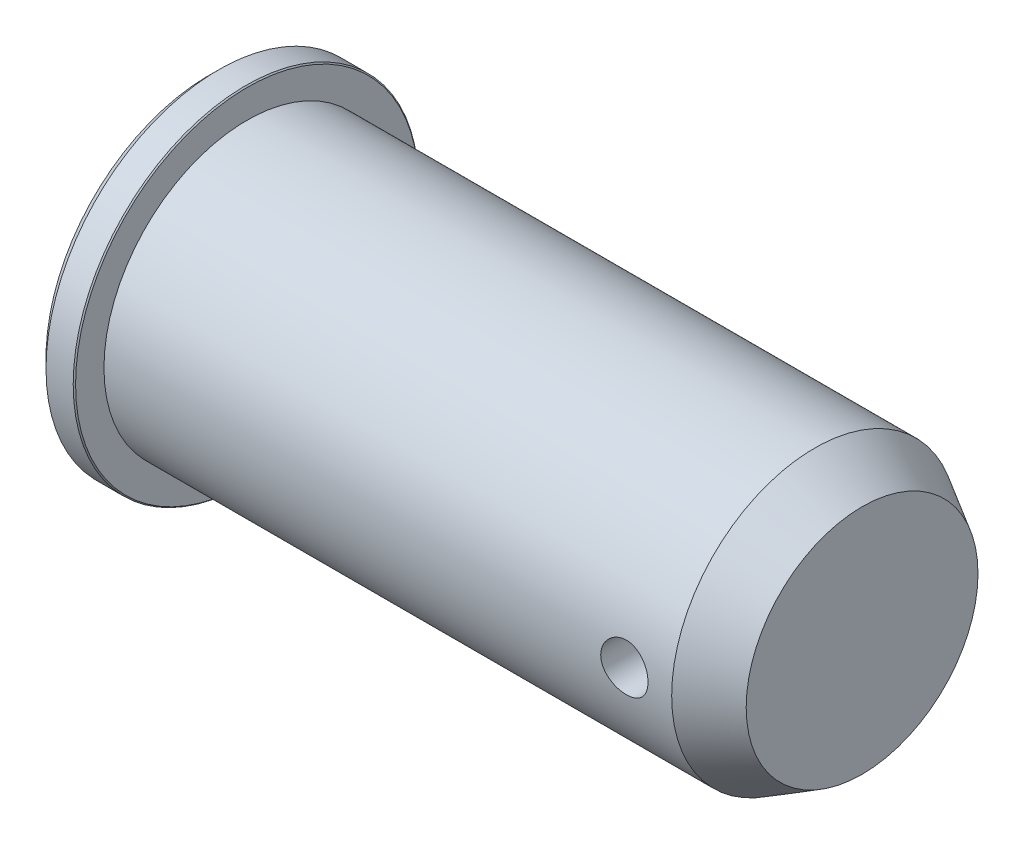
ISO-10303-21;
HEADER;
FILE_DESCRIPTION(('STEP AP214'),'2;1');
FILE_NAME('part.step','',(''),(''),'','','');
FILE_SCHEMA(('AUTOMOTIVE_DESIGN { 1 0 10303 214 1 1 1 1 }'));
ENDSEC;
DATA;
#1=APPLICATION_CONTEXT('core data for automotive mechanical design processes');
#2=APPLICATION_PROTOCOL_DEFINITION('international standard','automotive_design',2000,#1);
#3=PRODUCT_CONTEXT('',#1,'mechanical');
#4=PRODUCT('Part','Part','',(#3));
#5=PRODUCT_RELATED_PRODUCT_CATEGORY('part','',(#4));
#6=PRODUCT_DEFINITION_FORMATION('','',#4);
#7=PRODUCT_DEFINITION_CONTEXT('part definition',#1,'design');
#8=PRODUCT_DEFINITION('design','',#6,#7);
#9=PRODUCT_DEFINITION_SHAPE('','',#8);
#10=(LENGTH_UNIT() NAMED_UNIT(*) SI_UNIT(.MILLI.,.METRE.));
#11=(NAMED_UNIT(*) PLANE_ANGLE_UNIT() SI_UNIT($,.RADIAN.));
#12=(NAMED_UNIT(*) SI_UNIT($,.STERADIAN.) SOLID_ANGLE_UNIT());
#13=UNCERTAINTY_MEASURE_WITH_UNIT(LENGTH_MEASURE(1.E-05),#10,'distance_accuracy_value','');
#14=(GEOMETRIC_REPRESENTATION_CONTEXT(3) GLOBAL_UNCERTAINTY_ASSIGNED_CONTEXT((#13)) GLOBAL_UNIT_ASSIGNED_CONTEXT((#10,
#11,#12)) REPRESENTATION_CONTEXT('',''));
#15=CARTESIAN_POINT('',(0.,0.,0.));
#16=DIRECTION('',(0.,0.,1.));
#17=DIRECTION('',(1.,0.,0.));
#18=AXIS2_PLACEMENT_3D('',#15,#16,#17);
#19=CARTESIAN_POINT('',(0.,0.,0.));
#20=DIRECTION('',(1.,0.,0.));
#21=DIRECTION('',(0.,0.,-1.));
#22=AXIS2_PLACEMENT_3D('',#19,#20,#21);
#23=PLANE('',#22);
#24=CARTESIAN_POINT('',(0.,0.,0.));
#25=DIRECTION('',(1.,0.,0.));
#26=DIRECTION('',(0.,0.,-1.));
#27=AXIS2_PLACEMENT_3D('',#24,#25,#26);
#28=CIRCLE('',#27,34.5);
#29=CARTESIAN_POINT('',(0.,0.,-34.5));
#30=VERTEX_POINT('',#29);
#31=EDGE_CURVE('E47',#30,#30,#28,.F.);
#32=ORIENTED_EDGE('',*,*,#31,.T.);
#33=EDGE_LOOP('',(#32));
#34=FACE_BOUND('',#33,.T.);
#35=ADVANCED_FACE('F32',(#34),#23,.F.);
#36=CARTESIAN_POINT('',(0.,0.,0.));
#37=DIRECTION('',(-1.,0.,0.));
#38=DIRECTION('',(0.,0.,1.));
#39=AXIS2_PLACEMENT_3D('',#36,#37,#38);
#40=CYLINDRICAL_SURFACE('',#39,36.5);
#41=CARTESIAN_POINT('',(7.74999999999998,0.,0.));
#42=DIRECTION('',(-1.,0.,0.));
#43=DIRECTION('',(0.,0.,1.));
#44=AXIS2_PLACEMENT_3D('',#41,#42,#43);
#45=CIRCLE('',#44,36.5);
#46=CARTESIAN_POINT('',(7.74999999999998,0.,36.5));
#47=VERTEX_POINT('',#46);
#48=EDGE_CURVE('E39',#47,#47,#45,.T.);
#49=ORIENTED_EDGE('',*,*,#48,.T.);
#50=EDGE_LOOP('',(#49));
#51=FACE_BOUND('',#50,.T.);
#52=CARTESIAN_POINT('',(1.99999999999995,0.,0.));
#53=DIRECTION('',(1.,0.,0.));
#54=DIRECTION('',(0.,0.,-1.));
#55=AXIS2_PLACEMENT_3D('',#52,#53,#54);
#56=CIRCLE('',#55,36.5);
#57=CARTESIAN_POINT('',(1.99999999999995,0.,-36.5));
#58=VERTEX_POINT('',#57);
#59=EDGE_CURVE('E43',#58,#58,#56,.T.);
#60=ORIENTED_EDGE('',*,*,#59,.T.);
#61=EDGE_LOOP('',(#60));
#62=FACE_BOUND('',#61,.T.);
#63=ADVANCED_FACE('F86',(#51,#62),#40,.T.);
#64=CARTESIAN_POINT('',(8.,36.5,0.));
#65=DIRECTION('',(-1.,0.,0.));
#66=DIRECTION('',(0.,0.,1.));
#67=AXIS2_PLACEMENT_3D('',#64,#65,#66);
#68=PLANE('',#67);
#69=CARTESIAN_POINT('',(8.,0.,0.));
#70=DIRECTION('',(-1.,0.,0.));
#71=DIRECTION('',(0.,0.,1.));
#72=AXIS2_PLACEMENT_3D('',#69,#70,#71);
#73=CIRCLE('',#72,36.25);
#74=CARTESIAN_POINT('',(8.,0.,36.25));
#75=VERTEX_POINT('',#74);
#76=EDGE_CURVE('E10',#75,#75,#73,.F.);
#77=ORIENTED_EDGE('',*,*,#76,.T.);
#78=EDGE_LOOP('',(#77));
#79=FACE_BOUND('',#78,.T.);
#80=CARTESIAN_POINT('',(8.,0.,0.));
#81=DIRECTION('',(-1.,0.,0.));
#82=DIRECTION('',(0.,0.,1.));
#83=AXIS2_PLACEMENT_3D('',#80,#81,#82);
#84=CIRCLE('',#83,30.25);
#85=CARTESIAN_POINT('',(8.,0.,30.25));
#86=VERTEX_POINT('',#85);
#87=EDGE_CURVE('E101',#86,#86,#84,.T.);
#88=ORIENTED_EDGE('',*,*,#87,.T.);
#89=EDGE_LOOP('',(#88));
#90=FACE_BOUND('',#89,.T.);
#91=ADVANCED_FACE('F81',(#79,#90),#68,.F.);
#92=CARTESIAN_POINT('',(0.,0.,0.));
#93=DIRECTION('',(-1.,0.,0.));
#94=DIRECTION('',(0.,0.,1.));
#95=AXIS2_PLACEMENT_3D('',#92,#93,#94);
#96=CYLINDRICAL_SURFACE('',#95,30.25);
#97=CARTESIAN_POINT('',(123.,0.,30.25));
#98=CARTESIAN_POINT('',(123.000002126859,-0.139455638947404,30.2500009179522));
#99=CARTESIAN_POINT('',(122.994163818373,-0.278882400769715,30.2490338507295));
#100=CARTESIAN_POINT('',(122.970858655616,-0.556777272751616,30.2451945756554));
#101=CARTESIAN_POINT('',(122.953389486641,-0.695245186543641,30.2423219885796));
#102=CARTESIAN_POINT('',(122.906937833428,-0.970271296017671,30.2347485000166));
#103=CARTESIAN_POINT('',(122.877948037102,-1.10682822171105,30.23004643741));
#104=CARTESIAN_POINT('',(122.808664560122,-1.37702692567407,30.2189441547343));
#105=CARTESIAN_POINT('',(122.768366732031,-1.5106676149392,30.2125433116518));
#106=CARTESIAN_POINT('',(122.676829074361,-1.7738835271414,30.1982315866526));
#107=CARTESIAN_POINT('',(122.625602347021,-1.90346340694695,30.190322514089));
#108=CARTESIAN_POINT('',(122.512534266289,-2.15787371759553,30.1732057191485));
#109=CARTESIAN_POINT('',(122.45068900123,-2.28270237740313,30.1639975184211));
#110=CARTESIAN_POINT('',(122.316875749848,-2.5266435594419,30.144544096046));
#111=CARTESIAN_POINT('',(122.244912820146,-2.6457588974443,30.1342993931356));
#112=CARTESIAN_POINT('',(122.091319756201,-2.87757582316959,30.1130472170553));
#113=CARTESIAN_POINT('',(122.009686028237,-2.99027500343513,30.102039460965));
#114=CARTESIAN_POINT('',(121.83664276792,-3.20933189329885,30.0794765979095));
#115=CARTESIAN_POINT('',(121.745159779859,-3.3156312021363,30.0679177958889));
#116=CARTESIAN_POINT('',(121.553564644467,-3.52020245445552,30.0446547511578));
#117=CARTESIAN_POINT('',(121.453449315073,-3.61847141155653,30.032950456188));
#118=CARTESIAN_POINT('',(121.245337687113,-3.80623415171663,30.009732256655));
#119=CARTESIAN_POINT('',(121.137343796845,-3.89573059689259,29.9982182952204));
#120=CARTESIAN_POINT('',(120.914145944856,-4.0653919313069,29.9756971021855));
#121=CARTESIAN_POINT('',(120.798939338604,-4.14555336670429,29.9646900590438));
#122=CARTESIAN_POINT('',(120.561465578005,-4.29636938529598,29.9434391094942));
#123=CARTESIAN_POINT('',(120.439161945184,-4.36696721775163,29.933199906938));
#124=CARTESIAN_POINT('',(120.188907491808,-4.49762376501559,29.913847026984));
#125=CARTESIAN_POINT('',(120.060954584238,-4.55767854342854,29.9047337703484));
#126=CARTESIAN_POINT('',(119.800389201827,-4.66674686844476,29.8879077160845));
#127=CARTESIAN_POINT('',(119.667778718338,-4.71576506888978,29.8801943284345));
#128=CARTESIAN_POINT('',(119.398797512757,-4.80243382822669,29.8663862409762));
#129=CARTESIAN_POINT('',(119.26242543727,-4.84008023583318,29.860292132385));
#130=CARTESIAN_POINT('',(118.851728284335,-4.93485668959371,29.844831866484));
#131=CARTESIAN_POINT('',(118.573144946642,-4.97494023323196,29.838109465173));
#132=CARTESIAN_POINT('',(118.01328456859,-5.00784997835231,29.8326027797222));
#133=CARTESIAN_POINT('',(117.732007717095,-5.00067946933103,29.8338179430247));
#134=CARTESIAN_POINT('',(117.177566791931,-4.93969180756981,29.8439754095978));
#135=CARTESIAN_POINT('',(116.904349391953,-4.88634806907101,29.8528392877382));
#136=CARTESIAN_POINT('',(116.37080742075,-4.73525416789615,29.8771763703942));
#137=CARTESIAN_POINT('',(116.110483285399,-4.63750250508857,29.892649798184));
#138=CARTESIAN_POINT('',(115.608684669744,-4.39989085316463,29.9285464530083));
#139=CARTESIAN_POINT('',(115.367305169097,-4.25983388525598,29.9489927456377));
#140=CARTESIAN_POINT('',(114.911295082866,-3.94172602280417,29.9925155362905));
#141=CARTESIAN_POINT('',(114.696666623592,-3.76367211111489,30.0155922431139));
#142=CARTESIAN_POINT('',(114.297508762645,-3.37204318255761,30.0621205191662));
#143=CARTESIAN_POINT('',(114.113377965752,-3.15806179423528,30.0855732298983));
#144=CARTESIAN_POINT('',(113.78357592905,-2.7020272679772,30.1299509827977));
#145=CARTESIAN_POINT('',(113.637904929537,-2.45997395466278,30.1508760091717));
#146=CARTESIAN_POINT('',(113.38912257457,-1.95429434555044,30.1878697127002));
#147=CARTESIAN_POINT('',(113.28604604666,-1.69065060644196,30.2039344129259));
#148=CARTESIAN_POINT('',(113.125746518951,-1.14946879203915,30.2293653631587));
#149=CARTESIAN_POINT('',(113.06851974718,-0.871931861707358,30.2387321641823));
#150=CARTESIAN_POINT('',(113.002083652741,-0.31427794657806,30.2496379326016));
#151=CARTESIAN_POINT('',(112.992327054807,-0.0342278448328514,30.2512661121133));
#152=CARTESIAN_POINT('',(113.019649766251,0.52350586120321,30.2467554011814));
#153=CARTESIAN_POINT('',(113.056727304201,0.801189554599884,30.2406168045043));
#154=CARTESIAN_POINT('',(113.176210591497,1.34462042608354,30.2213175137807));
#155=CARTESIAN_POINT('',(113.258345768447,1.61042871214491,30.2081987498463));
#156=CARTESIAN_POINT('',(113.465324718166,2.12450244656325,30.1764043312468));
#157=CARTESIAN_POINT('',(113.590170856396,2.3727669223725,30.1577283688148));
#158=CARTESIAN_POINT('',(113.880283604538,2.84708544424052,30.1166703987549));
#159=CARTESIAN_POINT('',(114.045892528749,3.07292739503225,30.0942575527646));
#160=CARTESIAN_POINT('',(114.412359442995,3.49380974600917,30.0483061052849));
#161=CARTESIAN_POINT('',(114.613219948643,3.68884794609759,30.0247674235411));
#162=CARTESIAN_POINT('',(115.046937516672,4.04461212288573,29.9789291324084));
#163=CARTESIAN_POINT('',(115.280099490977,4.20496858526366,29.9566445763081));
#164=CARTESIAN_POINT('',(115.770383781267,4.48423645106497,29.9161181452449));
#165=CARTESIAN_POINT('',(116.027505346545,4.60314915245815,29.8978761436805));
#166=CARTESIAN_POINT('',(116.557317655249,4.79560433115696,29.867610825984));
#167=CARTESIAN_POINT('',(116.829939924203,4.86933162740711,29.8555622105322));
#168=CARTESIAN_POINT('',(117.384070229102,4.96988786859791,29.8389916440146));
#169=CARTESIAN_POINT('',(117.665577504395,4.99672081717077,29.8344690504119));
#170=CARTESIAN_POINT('',(118.086203724859,5.00120216452357,29.8337117032016));
#171=CARTESIAN_POINT('',(118.225352620461,4.99685885130024,29.8344427474576));
#172=CARTESIAN_POINT('',(118.502767535132,4.97659797500554,29.8378302016414));
#173=CARTESIAN_POINT('',(118.641033866142,4.96068475928358,29.8404858883905));
#174=CARTESIAN_POINT('',(118.915750978702,4.91739303740642,29.8476501119408));
#175=CARTESIAN_POINT('',(119.052201093401,4.8900104337176,29.852159310914));
#176=CARTESIAN_POINT('',(119.322234928827,4.82400282452437,29.8628969682249));
#177=CARTESIAN_POINT('',(119.455819663181,4.78538186742973,29.8691248074124));
#178=CARTESIAN_POINT('',(119.71913390499,4.69721639725926,29.8831164070874));
#179=CARTESIAN_POINT('',(119.848866328239,4.64768039790722,29.8908789700095));
#180=CARTESIAN_POINT('',(120.103645786332,4.53805027453648,29.9077192745733));
#181=CARTESIAN_POINT('',(120.228694480925,4.47795993438398,29.9167965446716));
#182=CARTESIAN_POINT('',(120.473353078271,4.34761363078593,29.9360166836689));
#183=CARTESIAN_POINT('',(120.592960829793,4.27735369163136,29.9461599688896));
#184=CARTESIAN_POINT('',(120.825838471266,4.12720543642081,29.9672223915387));
#185=CARTESIAN_POINT('',(120.93911057051,4.0473205077132,29.9781412554636));
#186=CARTESIAN_POINT('',(121.15992833887,3.87743356763736,30.00059059036));
#187=CARTESIAN_POINT('',(121.26738860573,3.78732129201924,30.0121268437462));
#188=CARTESIAN_POINT('',(121.474316457888,3.59843613951505,30.0353592582278));
#189=CARTESIAN_POINT('',(121.573786885365,3.49966636868973,30.0470553607132));
#190=CARTESIAN_POINT('',(121.76415264477,3.29405451597667,30.0702911920451));
#191=CARTESIAN_POINT('',(121.855042824382,3.18720765237879,30.0818308234164));
#192=CARTESIAN_POINT('',(122.027517983476,2.96626576618281,30.1044198065345));
#193=CARTESIAN_POINT('',(122.109106385386,2.85217343364193,30.1154693376849));
#194=CARTESIAN_POINT('',(122.262992992262,2.6166429839702,30.1368505151957));
#195=CARTESIAN_POINT('',(122.33522035033,2.4951580401025,30.1471764427747));
#196=CARTESIAN_POINT('',(122.469141583572,2.24648839745037,30.1667256782489));
#197=CARTESIAN_POINT('',(122.530839333711,2.11930581728148,30.1759493913899));
#198=CARTESIAN_POINT('',(122.643236752245,1.86018259009587,30.1930299949061));
#199=CARTESIAN_POINT('',(122.693944090686,1.72824533677824,30.2008878377385));
#200=CARTESIAN_POINT('',(122.784018867423,1.46051902607252,30.2150188577067));
#201=CARTESIAN_POINT('',(122.823388747966,1.3247308051703,30.2212923760922));
#202=CARTESIAN_POINT('',(122.904369219693,0.993482976959471,30.2343034133769));
#203=CARTESIAN_POINT('',(122.940188380187,0.796543057878598,30.2401622531852));
#204=CARTESIAN_POINT('',(122.988002046791,0.399715628918002,30.2480098563762));
#205=CARTESIAN_POINT('',(122.99999695239,0.199828168519721,30.249998684652));
#206=CARTESIAN_POINT('',(123.,0.,30.25));
#207=B_SPLINE_CURVE_WITH_KNOTS('',3,(#97,#98,#99,#100,#101,#102,#103,#104,#105,#106,#107,#108,
#109,#110,#111,#112,#113,#114,#115,#116,#117,#118,#119,#120,#121,#122,#123,#124,#125,#126,#127,
#128,#129,#130,#131,#132,#133,#134,#135,#136,#137,#138,#139,#140,#141,#142,#143,#144,#145,#146,
#147,#148,#149,#150,#151,#152,#153,#154,#155,#156,#157,#158,#159,#160,#161,#162,#163,#164,#165,
#166,#167,#168,#169,#170,#171,#172,#173,#174,#175,#176,#177,#178,#179,#180,#181,#182,#183,#184,
#185,#186,#187,#188,#189,#190,#191,#192,#193,#194,#195,#196,#197,#198,#199,#200,#201,#202,#203,
#204,#205,#206),.UNSPECIFIED.,.T.,.F.,(4,2,2,2,2,2,2,2,2,2,2,2,2,2,2,2,2,2,2,2,2,2,2,2,2,2,2,2,
2,2,2,2,2,2,2,2,2,2,2,2,2,2,2,2,2,2,2,2,2,2,2,2,2,2,4),(0.,0.418191773325815,0.836466797512651,
1.2550077239324,1.67370235934696,2.09189783053831,2.51024768879464,2.92838920188431,
3.34668658891098,3.76835376910454,4.1901770547531,4.61187193451698,5.03372234389672,
5.45797556938541,5.88238686036936,6.30661885142775,6.73100552220014,7.57117277431955,
8.41128154048953,9.24287734899526,10.0745012514927,10.9100586017145,11.7456823240449,
12.5914876713361,13.4372983030607,14.2837991533843,15.1302303565532,15.9668796976659,
16.8034973947537,17.6351453159912,18.4668393038362,19.3057713300136,20.1447632481758,
20.9922961832,21.8398025721047,22.6838189130085,23.5277631920055,23.9450121997575,
24.36210450866,24.7793459545039,25.1964372824787,25.6132044240047,26.0298224530315,
26.4466037970832,26.8632388882647,27.284892036694,27.706394522467,28.1281485256202,
28.5497468475441,28.9743697147719,29.3988359794472,29.8230050547196,30.2470826895537,
30.8463262775184,31.4455598171906),.UNSPECIFIED.);
#208=CARTESIAN_POINT('',(123.,0.,30.25));
#209=VERTEX_POINT('',#208);
#210=EDGE_CURVE('E50',#209,#209,#207,.T.);
#211=ORIENTED_EDGE('',*,*,#210,.T.);
#212=EDGE_LOOP('',(#211));
#213=FACE_BOUND('',#212,.T.);
#214=CARTESIAN_POINT('',(123.,0.,-30.25));
#215=CARTESIAN_POINT('',(123.000002126859,0.139455638947404,-30.2500009179522));
#216=CARTESIAN_POINT('',(122.994163818373,0.278882400769715,-30.2490338507295));
#217=CARTESIAN_POINT('',(122.970858655616,0.556777272751616,-30.2451945756554));
#218=CARTESIAN_POINT('',(122.953389486641,0.695245186543641,-30.2423219885796));
#219=CARTESIAN_POINT('',(122.906937833428,0.970271296017671,-30.2347485000166));
#220=CARTESIAN_POINT('',(122.877948037102,1.10682822171105,-30.23004643741));
#221=CARTESIAN_POINT('',(122.808664560122,1.37702692567407,-30.2189441547343));
#222=CARTESIAN_POINT('',(122.768366732031,1.5106676149392,-30.2125433116518));
#223=CARTESIAN_POINT('',(122.676829074361,1.7738835271414,-30.1982315866526));
#224=CARTESIAN_POINT('',(122.625602347021,1.90346340694695,-30.190322514089));
#225=CARTESIAN_POINT('',(122.512534266289,2.15787371759553,-30.1732057191485));
#226=CARTESIAN_POINT('',(122.45068900123,2.28270237740313,-30.1639975184211));
#227=CARTESIAN_POINT('',(122.316875749848,2.5266435594419,-30.144544096046));
#228=CARTESIAN_POINT('',(122.244912820146,2.6457588974443,-30.1342993931356));
#229=CARTESIAN_POINT('',(122.091319756201,2.87757582316959,-30.1130472170553));
#230=CARTESIAN_POINT('',(122.009686028237,2.99027500343513,-30.102039460965));
#231=CARTESIAN_POINT('',(121.83664276792,3.20933189329885,-30.0794765979095));
#232=CARTESIAN_POINT('',(121.745159779859,3.3156312021363,-30.0679177958889));
#233=CARTESIAN_POINT('',(121.553564644467,3.52020245445552,-30.0446547511578));
#234=CARTESIAN_POINT('',(121.453449315073,3.61847141155653,-30.032950456188));
#235=CARTESIAN_POINT('',(121.245337687113,3.80623415171663,-30.009732256655));
#236=CARTESIAN_POINT('',(121.137343796845,3.89573059689259,-29.9982182952204));
#237=CARTESIAN_POINT('',(120.914145944856,4.0653919313069,-29.9756971021855));
#238=CARTESIAN_POINT('',(120.798939338604,4.14555336670429,-29.9646900590438));
#239=CARTESIAN_POINT('',(120.561465578005,4.29636938529598,-29.9434391094942));
#240=CARTESIAN_POINT('',(120.439161945184,4.36696721775163,-29.933199906938));
#241=CARTESIAN_POINT('',(120.188907491808,4.49762376501559,-29.913847026984));
#242=CARTESIAN_POINT('',(120.060954584238,4.55767854342854,-29.9047337703484));
#243=CARTESIAN_POINT('',(119.800389201827,4.66674686844476,-29.8879077160845));
#244=CARTESIAN_POINT('',(119.667778718338,4.71576506888978,-29.8801943284345));
#245=CARTESIAN_POINT('',(119.398797512757,4.80243382822669,-29.8663862409762));
#246=CARTESIAN_POINT('',(119.26242543727,4.84008023583318,-29.860292132385));
#247=CARTESIAN_POINT('',(118.851728284335,4.93485668959371,-29.844831866484));
#248=CARTESIAN_POINT('',(118.573144946642,4.97494023323196,-29.838109465173));
#249=CARTESIAN_POINT('',(118.01328456859,5.00784997835231,-29.8326027797222));
#250=CARTESIAN_POINT('',(117.732007717095,5.00067946933103,-29.8338179430247));
#251=CARTESIAN_POINT('',(117.177566791931,4.93969180756981,-29.8439754095978));
#252=CARTESIAN_POINT('',(116.904349391953,4.88634806907101,-29.8528392877382));
#253=CARTESIAN_POINT('',(116.37080742075,4.73525416789615,-29.8771763703942));
#254=CARTESIAN_POINT('',(116.110483285399,4.63750250508857,-29.892649798184));
#255=CARTESIAN_POINT('',(115.608684669744,4.39989085316463,-29.9285464530083));
#256=CARTESIAN_POINT('',(115.367305169097,4.25983388525598,-29.9489927456377));
#257=CARTESIAN_POINT('',(114.911295082866,3.94172602280417,-29.9925155362905));
#258=CARTESIAN_POINT('',(114.696666623592,3.76367211111489,-30.0155922431139));
#259=CARTESIAN_POINT('',(114.297508762645,3.37204318255761,-30.0621205191662));
#260=CARTESIAN_POINT('',(114.113377965752,3.15806179423528,-30.0855732298983));
#261=CARTESIAN_POINT('',(113.78357592905,2.7020272679772,-30.1299509827977));
#262=CARTESIAN_POINT('',(113.637904929537,2.45997395466278,-30.1508760091717));
#263=CARTESIAN_POINT('',(113.38912257457,1.95429434555044,-30.1878697127002));
#264=CARTESIAN_POINT('',(113.28604604666,1.69065060644196,-30.2039344129259));
#265=CARTESIAN_POINT('',(113.125746518951,1.14946879203915,-30.2293653631587));
#266=CARTESIAN_POINT('',(113.06851974718,0.871931861707358,-30.2387321641823));
#267=CARTESIAN_POINT('',(113.002083652741,0.31427794657806,-30.2496379326016));
#268=CARTESIAN_POINT('',(112.992327054807,0.0342278448328514,-30.2512661121133));
#269=CARTESIAN_POINT('',(113.019649766251,-0.52350586120321,-30.2467554011814));
#270=CARTESIAN_POINT('',(113.056727304201,-0.801189554599884,-30.2406168045043));
#271=CARTESIAN_POINT('',(113.176210591497,-1.34462042608354,-30.2213175137807));
#272=CARTESIAN_POINT('',(113.258345768447,-1.61042871214491,-30.2081987498463));
#273=CARTESIAN_POINT('',(113.465324718166,-2.12450244656325,-30.1764043312468));
#274=CARTESIAN_POINT('',(113.590170856396,-2.3727669223725,-30.1577283688148));
#275=CARTESIAN_POINT('',(113.880283604538,-2.84708544424052,-30.1166703987549));
#276=CARTESIAN_POINT('',(114.045892528749,-3.07292739503225,-30.0942575527646));
#277=CARTESIAN_POINT('',(114.412359442995,-3.49380974600917,-30.0483061052849));
#278=CARTESIAN_POINT('',(114.613219948643,-3.68884794609759,-30.0247674235411));
#279=CARTESIAN_POINT('',(115.046937516672,-4.04461212288573,-29.9789291324084));
#280=CARTESIAN_POINT('',(115.280099490977,-4.20496858526366,-29.9566445763081));
#281=CARTESIAN_POINT('',(115.770383781267,-4.48423645106497,-29.9161181452449));
#282=CARTESIAN_POINT('',(116.027505346545,-4.60314915245815,-29.8978761436805));
#283=CARTESIAN_POINT('',(116.557317655249,-4.79560433115696,-29.867610825984));
#284=CARTESIAN_POINT('',(116.829939924203,-4.86933162740711,-29.8555622105322));
#285=CARTESIAN_POINT('',(117.384070229102,-4.96988786859791,-29.8389916440146));
#286=CARTESIAN_POINT('',(117.665577504395,-4.99672081717077,-29.8344690504119));
#287=CARTESIAN_POINT('',(118.086203724859,-5.00120216452357,-29.8337117032016));
#288=CARTESIAN_POINT('',(118.225352620461,-4.99685885130024,-29.8344427474576));
#289=CARTESIAN_POINT('',(118.502767535132,-4.97659797500554,-29.8378302016414));
#290=CARTESIAN_POINT('',(118.641033866142,-4.96068475928358,-29.8404858883905));
#291=CARTESIAN_POINT('',(118.915750978702,-4.91739303740642,-29.8476501119408));
#292=CARTESIAN_POINT('',(119.052201093401,-4.8900104337176,-29.852159310914));
#293=CARTESIAN_POINT('',(119.322234928827,-4.82400282452437,-29.8628969682249));
#294=CARTESIAN_POINT('',(119.455819663181,-4.78538186742973,-29.8691248074124));
#295=CARTESIAN_POINT('',(119.71913390499,-4.69721639725926,-29.8831164070874));
#296=CARTESIAN_POINT('',(119.848866328239,-4.64768039790722,-29.8908789700095));
#297=CARTESIAN_POINT('',(120.103645786332,-4.53805027453648,-29.9077192745733));
#298=CARTESIAN_POINT('',(120.228694480925,-4.47795993438398,-29.9167965446716));
#299=CARTESIAN_POINT('',(120.473353078271,-4.34761363078593,-29.9360166836689));
#300=CARTESIAN_POINT('',(120.592960829793,-4.27735369163136,-29.9461599688896));
#301=CARTESIAN_POINT('',(120.825838471266,-4.12720543642081,-29.9672223915387));
#302=CARTESIAN_POINT('',(120.93911057051,-4.0473205077132,-29.9781412554636));
#303=CARTESIAN_POINT('',(121.15992833887,-3.87743356763736,-30.00059059036));
#304=CARTESIAN_POINT('',(121.26738860573,-3.78732129201924,-30.0121268437462));
#305=CARTESIAN_POINT('',(121.474316457888,-3.59843613951505,-30.0353592582278));
#306=CARTESIAN_POINT('',(121.573786885365,-3.49966636868973,-30.0470553607132));
#307=CARTESIAN_POINT('',(121.76415264477,-3.29405451597667,-30.0702911920451));
#308=CARTESIAN_POINT('',(121.855042824382,-3.18720765237879,-30.0818308234164));
#309=CARTESIAN_POINT('',(122.027517983476,-2.96626576618281,-30.1044198065345));
#310=CARTESIAN_POINT('',(122.109106385386,-2.85217343364193,-30.1154693376849));
#311=CARTESIAN_POINT('',(122.262992992262,-2.6166429839702,-30.1368505151957));
#312=CARTESIAN_POINT('',(122.33522035033,-2.4951580401025,-30.1471764427747));
#313=CARTESIAN_POINT('',(122.469141583572,-2.24648839745037,-30.1667256782489));
#314=CARTESIAN_POINT('',(122.530839333711,-2.11930581728148,-30.1759493913899));
#315=CARTESIAN_POINT('',(122.643236752245,-1.86018259009587,-30.1930299949061));
#316=CARTESIAN_POINT('',(122.693944090686,-1.72824533677824,-30.2008878377385));
#317=CARTESIAN_POINT('',(122.784018867423,-1.46051902607252,-30.2150188577067));
#318=CARTESIAN_POINT('',(122.823388747966,-1.3247308051703,-30.2212923760922));
#319=CARTESIAN_POINT('',(122.904369219693,-0.993482976959471,-30.2343034133769));
#320=CARTESIAN_POINT('',(122.940188380187,-0.796543057878598,-30.2401622531852));
#321=CARTESIAN_POINT('',(122.988002046791,-0.399715628918002,-30.2480098563762));
#322=CARTESIAN_POINT('',(122.99999695239,-0.199828168519721,-30.249998684652));
#323=CARTESIAN_POINT('',(123.,0.,-30.25));
#324=B_SPLINE_CURVE_WITH_KNOTS('',3,(#214,#215,#216,#217,#218,#219,#220,#221,#222,#223,#224,
#225,#226,#227,#228,#229,#230,#231,#232,#233,#234,#235,#236,#237,#238,#239,#240,#241,#242,#243,
#244,#245,#246,#247,#248,#249,#250,#251,#252,#253,#254,#255,#256,#257,#258,#259,#260,#261,#262,
#263,#264,#265,#266,#267,#268,#269,#270,#271,#272,#273,#274,#275,#276,#277,#278,#279,#280,#281,
#282,#283,#284,#285,#286,#287,#288,#289,#290,#291,#292,#293,#294,#295,#296,#297,#298,#299,#300,
#301,#302,#303,#304,#305,#306,#307,#308,#309,#310,#311,#312,#313,#314,#315,#316,#317,#318,#319,
#320,#321,#322,#323),.UNSPECIFIED.,.T.,.F.,(4,2,2,2,2,2,2,2,2,2,2,2,2,2,2,2,2,2,2,2,2,2,2,2,2,2,
2,2,2,2,2,2,2,2,2,2,2,2,2,2,2,2,2,2,2,2,2,2,2,2,2,2,2,2,4),(0.,0.418191773325815,
0.836466797512651,1.2550077239324,1.67370235934696,2.09189783053831,2.51024768879464,
2.92838920188431,3.34668658891098,3.76835376910454,4.1901770547531,4.61187193451698,
5.03372234389672,5.45797556938541,5.88238686036936,6.30661885142775,6.73100552220014,
7.57117277431955,8.41128154048953,9.24287734899526,10.0745012514927,10.9100586017145,
11.7456823240449,12.5914876713361,13.4372983030607,14.2837991533843,15.1302303565532,
15.9668796976659,16.8034973947537,17.6351453159912,18.4668393038362,19.3057713300136,
20.1447632481758,20.9922961832,21.8398025721047,22.6838189130085,23.5277631920055,
23.9450121997575,24.36210450866,24.7793459545039,25.1964372824787,25.6132044240047,
26.0298224530315,26.4466037970832,26.8632388882647,27.284892036694,27.706394522467,
28.1281485256202,28.5497468475441,28.9743697147719,29.3988359794472,29.8230050547196,
30.2470826895537,30.8463262775184,31.4455598171906),.UNSPECIFIED.);
#325=CARTESIAN_POINT('',(123.,0.,-30.25));
#326=VERTEX_POINT('',#325);
#327=EDGE_CURVE('E58',#326,#326,#324,.T.);
#328=ORIENTED_EDGE('',*,*,#327,.T.);
#329=EDGE_LOOP('',(#328));
#330=FACE_BOUND('',#329,.T.);
#331=ORIENTED_EDGE('',*,*,#87,.F.);
#332=EDGE_LOOP('',(#331));
#333=FACE_BOUND('',#332,.T.);
#334=CARTESIAN_POINT('',(128.,0.,0.));
#335=DIRECTION('',(-1.,0.,0.));
#336=DIRECTION('',(0.,0.,1.));
#337=AXIS2_PLACEMENT_3D('',#334,#335,#336);
#338=CIRCLE('',#337,30.25);
#339=CARTESIAN_POINT('',(128.,0.,30.25));
#340=VERTEX_POINT('',#339);
#341=EDGE_CURVE('E104',#340,#340,#338,.T.);
#342=ORIENTED_EDGE('',*,*,#341,.T.);
#343=EDGE_LOOP('',(#342));
#344=FACE_BOUND('',#343,.T.);
#345=ADVANCED_FACE('F61',(#213,#330,#333,#344),#96,.T.);
#346=CARTESIAN_POINT('',(138.,0.,0.));
#347=DIRECTION('',(-1.,0.,0.));
#348=DIRECTION('',(0.,0.,1.));
#349=AXIS2_PLACEMENT_3D('',#346,#347,#348);
#350=CONICAL_SURFACE('',#349,24.5,0.52183427981441);
#351=ORIENTED_EDGE('',*,*,#341,.F.);
#352=EDGE_LOOP('',(#351));
#353=FACE_BOUND('',#352,.T.);
#354=CARTESIAN_POINT('',(138.,0.,0.));
#355=DIRECTION('',(-1.,0.,0.));
#356=DIRECTION('',(0.,0.,1.));
#357=AXIS2_PLACEMENT_3D('',#354,#355,#356);
#358=CIRCLE('',#357,24.5);
#359=CARTESIAN_POINT('',(138.,0.,24.5));
#360=VERTEX_POINT('',#359);
#361=EDGE_CURVE('E57',#360,#360,#358,.T.);
#362=ORIENTED_EDGE('',*,*,#361,.T.);
#363=EDGE_LOOP('',(#362));
#364=FACE_BOUND('',#363,.T.);
#365=ADVANCED_FACE('F74',(#353,#364),#350,.T.);
#366=CARTESIAN_POINT('',(138.,24.5,0.));
#367=DIRECTION('',(-1.,0.,0.));
#368=DIRECTION('',(0.,0.,1.));
#369=AXIS2_PLACEMENT_3D('',#366,#367,#368);
#370=PLANE('',#369);
#371=ORIENTED_EDGE('',*,*,#361,.F.);
#372=EDGE_LOOP('',(#371));
#373=FACE_BOUND('',#372,.T.);
#374=ADVANCED_FACE('F71',(#373),#370,.F.);
#375=CARTESIAN_POINT('',(0.,0.,0.));
#376=DIRECTION('',(1.,0.,0.));
#377=DIRECTION('',(0.,0.,-1.));
#378=AXIS2_PLACEMENT_3D('',#375,#376,#377);
#379=CONICAL_SURFACE('',#378,34.5,0.785398163397452);
#380=ORIENTED_EDGE('',*,*,#59,.F.);
#381=EDGE_LOOP('',(#380));
#382=FACE_BOUND('',#381,.T.);
#383=ORIENTED_EDGE('',*,*,#31,.F.);
#384=EDGE_LOOP('',(#383));
#385=FACE_BOUND('',#384,.T.);
#386=ADVANCED_FACE('F69',(#382,#385),#379,.T.);
#387=CARTESIAN_POINT('',(118.,0.,-36.5));
#388=DIRECTION('',(0.,0.,1.));
#389=DIRECTION('',(1.,0.,0.));
#390=AXIS2_PLACEMENT_3D('',#387,#388,#389);
#391=CYLINDRICAL_SURFACE('',#390,5.);
#392=ORIENTED_EDGE('',*,*,#327,.F.);
#393=EDGE_LOOP('',(#392));
#394=FACE_BOUND('',#393,.T.);
#395=ORIENTED_EDGE('',*,*,#210,.F.);
#396=EDGE_LOOP('',(#395));
#397=FACE_BOUND('',#396,.T.);
#398=ADVANCED_FACE('F65',(#394,#397),#391,.F.);
#399=CARTESIAN_POINT('',(7.74999999999998,0.,0.));
#400=DIRECTION('',(-1.,0.,0.));
#401=DIRECTION('',(0.,0.,1.));
#402=AXIS2_PLACEMENT_3D('',#399,#400,#401);
#403=CONICAL_SURFACE('',#402,36.5,0.785398163397448);
#404=ORIENTED_EDGE('',*,*,#76,.F.);
#405=EDGE_LOOP('',(#404));
#406=FACE_BOUND('',#405,.T.);
#407=ORIENTED_EDGE('',*,*,#48,.F.);
#408=EDGE_LOOP('',(#407));
#409=FACE_BOUND('',#408,.T.);
#410=ADVANCED_FACE('F34',(#406,#409),#403,.T.);
#411=CLOSED_SHELL('',(#35,#63,#91,#345,#365,#374,#386,#398,#410));
#412=MANIFOLD_SOLID_BREP('B2',#411);
#413=ADVANCED_BREP_SHAPE_REPRESENTATION('',(#18,#412),#14);
#414=SHAPE_DEFINITION_REPRESENTATION(#9,#413);
ENDSEC;
END-ISO-10303-21;
